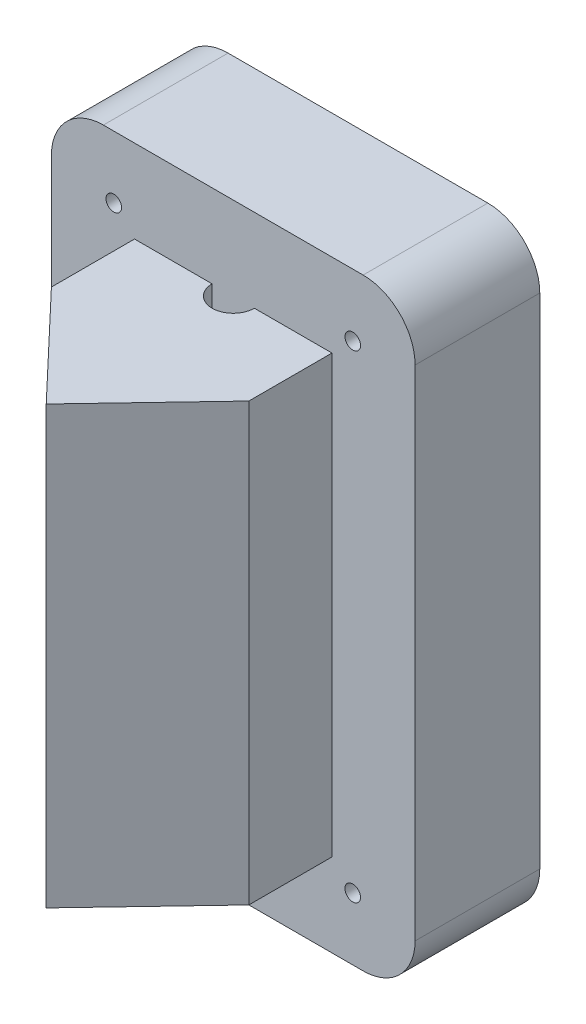
ISO-10303-21;
HEADER;
FILE_DESCRIPTION(('STEP AP214'),'2;1');
FILE_NAME('part.step','',(''),(''),'','','');
FILE_SCHEMA(('AUTOMOTIVE_DESIGN { 1 0 10303 214 1 1 1 1 }'));
ENDSEC;
DATA;
#1=APPLICATION_CONTEXT('core data for automotive mechanical design processes');
#2=APPLICATION_PROTOCOL_DEFINITION('international standard','automotive_design',2000,#1);
#3=PRODUCT_CONTEXT('',#1,'mechanical');
#4=PRODUCT('Part','Part','',(#3));
#5=PRODUCT_RELATED_PRODUCT_CATEGORY('part','',(#4));
#6=PRODUCT_DEFINITION_FORMATION('','',#4);
#7=PRODUCT_DEFINITION_CONTEXT('part definition',#1,'design');
#8=PRODUCT_DEFINITION('design','',#6,#7);
#9=PRODUCT_DEFINITION_SHAPE('','',#8);
#10=(LENGTH_UNIT() NAMED_UNIT(*) SI_UNIT(.MILLI.,.METRE.));
#11=(NAMED_UNIT(*) PLANE_ANGLE_UNIT() SI_UNIT($,.RADIAN.));
#12=(NAMED_UNIT(*) SI_UNIT($,.STERADIAN.) SOLID_ANGLE_UNIT());
#13=UNCERTAINTY_MEASURE_WITH_UNIT(LENGTH_MEASURE(1.E-05),#10,'distance_accuracy_value','');
#14=(GEOMETRIC_REPRESENTATION_CONTEXT(3) GLOBAL_UNCERTAINTY_ASSIGNED_CONTEXT((#13)) GLOBAL_UNIT_ASSIGNED_CONTEXT((#10,
#11,#12)) REPRESENTATION_CONTEXT('',''));
#15=CARTESIAN_POINT('',(0.,0.,0.));
#16=DIRECTION('',(0.,0.,1.));
#17=DIRECTION('',(1.,0.,0.));
#18=AXIS2_PLACEMENT_3D('',#15,#16,#17);
#19=CARTESIAN_POINT('',(-135.,250.,150.));
#20=DIRECTION('',(0.,-1.,0.));
#21=DIRECTION('',(0.,0.,-1.));
#22=AXIS2_PLACEMENT_3D('',#19,#20,#21);
#23=PLANE('',#22);
#24=DIRECTION('',(-1.,0.,0.));
#25=VECTOR('',#24,1.);
#26=CARTESIAN_POINT('',(-135.,250.,60.));
#27=LINE('',#26,#25);
#28=CARTESIAN_POINT('',(-40.,250.,60.));
#29=VERTEX_POINT('',#28);
#30=CARTESIAN_POINT('',(-77.3296602932821,250.,60.));
#31=VERTEX_POINT('',#30);
#32=EDGE_CURVE('E173',#29,#31,#27,.T.);
#33=ORIENTED_EDGE('',*,*,#32,.T.);
#34=CARTESIAN_POINT('',(-87.5,250.,60.));
#35=DIRECTION('',(0.,1.,0.));
#36=DIRECTION('',(0.,0.,1.));
#37=AXIS2_PLACEMENT_3D('',#34,#35,#36);
#38=CIRCLE('',#37,10.1703397067178);
#39=CARTESIAN_POINT('',(-97.6703397067178,250.,60.));
#40=VERTEX_POINT('',#39);
#41=EDGE_CURVE('E79',#40,#31,#38,.T.);
#42=ORIENTED_EDGE('',*,*,#41,.F.);
#43=CARTESIAN_POINT('',(-135.,250.,60.));
#44=VERTEX_POINT('',#43);
#45=EDGE_CURVE('E170',#40,#44,#27,.T.);
#46=ORIENTED_EDGE('',*,*,#45,.T.);
#47=DIRECTION('',(0.,0.,-1.));
#48=VECTOR('',#47,1.);
#49=CARTESIAN_POINT('',(-135.,250.,150.));
#50=LINE('',#49,#48);
#51=CARTESIAN_POINT('',(-135.,250.,100.));
#52=VERTEX_POINT('',#51);
#53=EDGE_CURVE('E196',#52,#44,#50,.T.);
#54=ORIENTED_EDGE('',*,*,#53,.F.);
#55=DIRECTION('',(0.688749461914693,0.,0.724999433594414));
#56=VECTOR('',#55,1.);
#57=CARTESIAN_POINT('',(-120.893561103811,250.,114.84888304862));
#58=LINE('',#57,#56);
#59=CARTESIAN_POINT('',(-87.5,250.,150.));
#60=VERTEX_POINT('',#59);
#61=EDGE_CURVE('E525',#52,#60,#58,.T.);
#62=ORIENTED_EDGE('',*,*,#61,.T.);
#63=DIRECTION('',(0.688749461914693,0.,-0.724999433594414));
#64=VECTOR('',#63,1.);
#65=CARTESIAN_POINT('',(28.9093298291721,250.,27.4638633377135));
#66=LINE('',#65,#64);
#67=CARTESIAN_POINT('',(-40.,250.,100.));
#68=VERTEX_POINT('',#67);
#69=EDGE_CURVE('E514',#60,#68,#66,.T.);
#70=ORIENTED_EDGE('',*,*,#69,.T.);
#71=DIRECTION('',(0.,0.,-1.));
#72=VECTOR('',#71,1.);
#73=CARTESIAN_POINT('',(-40.,250.,150.));
#74=LINE('',#73,#72);
#75=EDGE_CURVE('E198',#68,#29,#74,.T.);
#76=ORIENTED_EDGE('',*,*,#75,.T.);
#77=EDGE_LOOP('',(#33,#42,#46,#54,#62,#70,#76));
#78=FACE_BOUND('',#77,.T.);
#79=ADVANCED_FACE('F57',(#78),#23,.F.);
#80=CARTESIAN_POINT('',(-135.,40.,150.));
#81=DIRECTION('',(0.,1.,0.));
#82=DIRECTION('',(0.,0.,1.));
#83=AXIS2_PLACEMENT_3D('',#80,#81,#82);
#84=PLANE('',#83);
#85=DIRECTION('',(1.,0.,0.));
#86=VECTOR('',#85,1.);
#87=CARTESIAN_POINT('',(-135.,40.,60.));
#88=LINE('',#87,#86);
#89=CARTESIAN_POINT('',(-135.,40.,60.));
#90=VERTEX_POINT('',#89);
#91=CARTESIAN_POINT('',(-97.6703397067178,40.,60.));
#92=VERTEX_POINT('',#91);
#93=EDGE_CURVE('E189',#90,#92,#88,.T.);
#94=ORIENTED_EDGE('',*,*,#93,.T.);
#95=CARTESIAN_POINT('',(-87.5,40.,60.));
#96=DIRECTION('',(0.,1.,0.));
#97=DIRECTION('',(0.,0.,1.));
#98=AXIS2_PLACEMENT_3D('',#95,#96,#97);
#99=CIRCLE('',#98,10.1703397067178);
#100=CARTESIAN_POINT('',(-77.3296602932821,40.,60.));
#101=VERTEX_POINT('',#100);
#102=EDGE_CURVE('E163',#92,#101,#99,.T.);
#103=ORIENTED_EDGE('',*,*,#102,.T.);
#104=CARTESIAN_POINT('',(-40.,40.,60.));
#105=VERTEX_POINT('',#104);
#106=EDGE_CURVE('E188',#101,#105,#88,.T.);
#107=ORIENTED_EDGE('',*,*,#106,.T.);
#108=DIRECTION('',(0.,0.,-1.));
#109=VECTOR('',#108,1.);
#110=CARTESIAN_POINT('',(-40.,40.,150.));
#111=LINE('',#110,#109);
#112=CARTESIAN_POINT('',(-40.,40.,100.));
#113=VERTEX_POINT('',#112);
#114=EDGE_CURVE('E191',#113,#105,#111,.T.);
#115=ORIENTED_EDGE('',*,*,#114,.F.);
#116=DIRECTION('',(0.688749461914693,0.,-0.724999433594414));
#117=VECTOR('',#116,1.);
#118=CARTESIAN_POINT('',(-110.032851511169,40.,173.718791064389));
#119=LINE('',#118,#117);
#120=CARTESIAN_POINT('',(-87.5,40.,150.));
#121=VERTEX_POINT('',#120);
#122=EDGE_CURVE('E183',#121,#113,#119,.T.);
#123=ORIENTED_EDGE('',*,*,#122,.F.);
#124=DIRECTION('',(0.688749461914693,0.,0.724999433594414));
#125=VECTOR('',#124,1.);
#126=CARTESIAN_POINT('',(-110.032851511169,40.,126.281208935611));
#127=LINE('',#126,#125);
#128=CARTESIAN_POINT('',(-135.,40.,100.));
#129=VERTEX_POINT('',#128);
#130=EDGE_CURVE('E507',#129,#121,#127,.T.);
#131=ORIENTED_EDGE('',*,*,#130,.F.);
#132=DIRECTION('',(0.,0.,-1.));
#133=VECTOR('',#132,1.);
#134=CARTESIAN_POINT('',(-135.,40.,150.));
#135=LINE('',#134,#133);
#136=EDGE_CURVE('E194',#129,#90,#135,.T.);
#137=ORIENTED_EDGE('',*,*,#136,.T.);
#138=EDGE_LOOP('',(#94,#103,#107,#115,#123,#131,#137));
#139=FACE_BOUND('',#138,.T.);
#140=ADVANCED_FACE('F328',(#139),#84,.F.);
#141=CARTESIAN_POINT('',(-135.,40.,150.));
#142=DIRECTION('',(1.,0.,0.));
#143=DIRECTION('',(0.,0.,-1.));
#144=AXIS2_PLACEMENT_3D('',#141,#142,#143);
#145=PLANE('',#144);
#146=DIRECTION('',(0.,1.,0.));
#147=VECTOR('',#146,1.);
#148=CARTESIAN_POINT('',(-135.,0.,100.));
#149=LINE('',#148,#147);
#150=EDGE_CURVE('E511',#129,#52,#149,.T.);
#151=ORIENTED_EDGE('',*,*,#150,.T.);
#152=ORIENTED_EDGE('',*,*,#53,.T.);
#153=DIRECTION('',(0.,-1.,0.));
#154=VECTOR('',#153,1.);
#155=CARTESIAN_POINT('',(-135.,40.,60.));
#156=LINE('',#155,#154);
#157=EDGE_CURVE('E179',#44,#90,#156,.T.);
#158=ORIENTED_EDGE('',*,*,#157,.T.);
#159=ORIENTED_EDGE('',*,*,#136,.F.);
#160=EDGE_LOOP('',(#151,#152,#158,#159));
#161=FACE_BOUND('',#160,.T.);
#162=ADVANCED_FACE('F334',(#161),#145,.F.);
#163=CARTESIAN_POINT('',(-40.,250.,150.));
#164=DIRECTION('',(-1.,0.,0.));
#165=DIRECTION('',(0.,-1.,0.));
#166=AXIS2_PLACEMENT_3D('',#163,#164,#165);
#167=PLANE('',#166);
#168=DIRECTION('',(0.,1.,0.));
#169=VECTOR('',#168,1.);
#170=CARTESIAN_POINT('',(-40.,0.,100.));
#171=LINE('',#170,#169);
#172=EDGE_CURVE('E520',#113,#68,#171,.T.);
#173=ORIENTED_EDGE('',*,*,#172,.F.);
#174=ORIENTED_EDGE('',*,*,#114,.T.);
#175=DIRECTION('',(0.,1.,0.));
#176=VECTOR('',#175,1.);
#177=CARTESIAN_POINT('',(-40.,250.,60.));
#178=LINE('',#177,#176);
#179=EDGE_CURVE('E180',#105,#29,#178,.T.);
#180=ORIENTED_EDGE('',*,*,#179,.T.);
#181=ORIENTED_EDGE('',*,*,#75,.F.);
#182=EDGE_LOOP('',(#173,#174,#180,#181));
#183=FACE_BOUND('',#182,.T.);
#184=ADVANCED_FACE('F339',(#183),#167,.F.);
#185=CARTESIAN_POINT('',(0.,0.,60.));
#186=DIRECTION('',(0.,0.,1.));
#187=DIRECTION('',(1.,0.,0.));
#188=AXIS2_PLACEMENT_3D('',#185,#186,#187);
#189=PLANE('',#188);
#190=DIRECTION('',(0.,1.,0.));
#191=VECTOR('',#190,1.);
#192=CARTESIAN_POINT('',(-97.6703397067178,0.,60.));
#193=LINE('',#192,#191);
#194=EDGE_CURVE('E72',#92,#40,#193,.T.);
#195=ORIENTED_EDGE('',*,*,#194,.F.);
#196=ORIENTED_EDGE('',*,*,#93,.F.);
#197=ORIENTED_EDGE('',*,*,#157,.F.);
#198=ORIENTED_EDGE('',*,*,#45,.F.);
#199=EDGE_LOOP('',(#195,#196,#197,#198));
#200=FACE_BOUND('',#199,.T.);
#201=ORIENTED_EDGE('',*,*,#106,.F.);
#202=DIRECTION('',(0.,1.,0.));
#203=VECTOR('',#202,1.);
#204=CARTESIAN_POINT('',(-77.3296602932821,0.,60.));
#205=LINE('',#204,#203);
#206=EDGE_CURVE('E165',#101,#31,#205,.T.);
#207=ORIENTED_EDGE('',*,*,#206,.T.);
#208=ORIENTED_EDGE('',*,*,#32,.F.);
#209=ORIENTED_EDGE('',*,*,#179,.F.);
#210=EDGE_LOOP('',(#201,#207,#208,#209));
#211=FACE_BOUND('',#210,.T.);
#212=DIRECTION('',(1.,0.,0.));
#213=VECTOR('',#212,1.);
#214=CARTESIAN_POINT('',(0.,0.,60.));
#215=LINE('',#214,#213);
#216=CARTESIAN_POINT('',(-150.,0.,60.));
#217=VERTEX_POINT('',#216);
#218=CARTESIAN_POINT('',(-25.,0.,60.));
#219=VERTEX_POINT('',#218);
#220=EDGE_CURVE('E235',#217,#219,#215,.T.);
#221=ORIENTED_EDGE('',*,*,#220,.T.);
#222=CARTESIAN_POINT('',(-25.,25.,60.));
#223=DIRECTION('',(0.,0.,1.));
#224=DIRECTION('',(1.,0.,0.));
#225=AXIS2_PLACEMENT_3D('',#222,#223,#224);
#226=CIRCLE('',#225,25.);
#227=CARTESIAN_POINT('',(0.,25.,60.));
#228=VERTEX_POINT('',#227);
#229=EDGE_CURVE('E270',#219,#228,#226,.T.);
#230=ORIENTED_EDGE('',*,*,#229,.T.);
#231=DIRECTION('',(0.,1.,0.));
#232=VECTOR('',#231,1.);
#233=CARTESIAN_POINT('',(0.,0.,60.));
#234=LINE('',#233,#232);
#235=CARTESIAN_POINT('',(0.,265.,60.));
#236=VERTEX_POINT('',#235);
#237=EDGE_CURVE('E225',#228,#236,#234,.T.);
#238=ORIENTED_EDGE('',*,*,#237,.T.);
#239=CARTESIAN_POINT('',(-25.,265.,60.));
#240=DIRECTION('',(0.,0.,1.));
#241=DIRECTION('',(1.,0.,0.));
#242=AXIS2_PLACEMENT_3D('',#239,#240,#241);
#243=CIRCLE('',#242,25.);
#244=CARTESIAN_POINT('',(-25.,290.,60.));
#245=VERTEX_POINT('',#244);
#246=EDGE_CURVE('E268',#236,#245,#243,.T.);
#247=ORIENTED_EDGE('',*,*,#246,.T.);
#248=DIRECTION('',(-1.,0.,0.));
#249=VECTOR('',#248,1.);
#250=CARTESIAN_POINT('',(0.,290.,60.));
#251=LINE('',#250,#249);
#252=CARTESIAN_POINT('',(-150.,290.,60.));
#253=VERTEX_POINT('',#252);
#254=EDGE_CURVE('E228',#245,#253,#251,.T.);
#255=ORIENTED_EDGE('',*,*,#254,.T.);
#256=CARTESIAN_POINT('',(-150.,265.,60.));
#257=DIRECTION('',(0.,0.,1.));
#258=DIRECTION('',(1.,0.,0.));
#259=AXIS2_PLACEMENT_3D('',#256,#257,#258);
#260=CIRCLE('',#259,25.);
#261=CARTESIAN_POINT('',(-175.,265.,60.));
#262=VERTEX_POINT('',#261);
#263=EDGE_CURVE('E266',#253,#262,#260,.T.);
#264=ORIENTED_EDGE('',*,*,#263,.T.);
#265=DIRECTION('',(0.,-1.,0.));
#266=VECTOR('',#265,1.);
#267=CARTESIAN_POINT('',(-175.,0.,60.));
#268=LINE('',#267,#266);
#269=CARTESIAN_POINT('',(-175.,25.,60.));
#270=VERTEX_POINT('',#269);
#271=EDGE_CURVE('E232',#262,#270,#268,.T.);
#272=ORIENTED_EDGE('',*,*,#271,.T.);
#273=CARTESIAN_POINT('',(-150.,25.,60.));
#274=DIRECTION('',(0.,0.,1.));
#275=DIRECTION('',(1.,0.,0.));
#276=AXIS2_PLACEMENT_3D('',#273,#274,#275);
#277=CIRCLE('',#276,25.);
#278=EDGE_CURVE('E272',#270,#217,#277,.T.);
#279=ORIENTED_EDGE('',*,*,#278,.T.);
#280=EDGE_LOOP('',(#221,#230,#238,#247,#255,#264,#272,#279));
#281=FACE_BOUND('',#280,.T.);
#282=CARTESIAN_POINT('',(-30.,30.,60.));
#283=DIRECTION('',(0.,0.,1.));
#284=DIRECTION('',(1.,0.,0.));
#285=AXIS2_PLACEMENT_3D('',#282,#283,#284);
#286=CIRCLE('',#285,3.75);
#287=CARTESIAN_POINT('',(-26.25,30.,60.));
#288=VERTEX_POINT('',#287);
#289=EDGE_CURVE('E221',#288,#288,#286,.T.);
#290=ORIENTED_EDGE('',*,*,#289,.F.);
#291=EDGE_LOOP('',(#290));
#292=FACE_BOUND('',#291,.T.);
#293=CARTESIAN_POINT('',(-145.,260.,60.));
#294=DIRECTION('',(0.,0.,1.));
#295=DIRECTION('',(1.,0.,0.));
#296=AXIS2_PLACEMENT_3D('',#293,#294,#295);
#297=CIRCLE('',#296,3.75000000000001);
#298=CARTESIAN_POINT('',(-141.25,260.,60.));
#299=VERTEX_POINT('',#298);
#300=EDGE_CURVE('E218',#299,#299,#297,.T.);
#301=ORIENTED_EDGE('',*,*,#300,.F.);
#302=EDGE_LOOP('',(#301));
#303=FACE_BOUND('',#302,.T.);
#304=CARTESIAN_POINT('',(-30.,260.,60.));
#305=DIRECTION('',(0.,0.,1.));
#306=DIRECTION('',(1.,0.,0.));
#307=AXIS2_PLACEMENT_3D('',#304,#305,#306);
#308=CIRCLE('',#307,3.75);
#309=CARTESIAN_POINT('',(-26.25,260.,60.));
#310=VERTEX_POINT('',#309);
#311=EDGE_CURVE('E215',#310,#310,#308,.T.);
#312=ORIENTED_EDGE('',*,*,#311,.F.);
#313=EDGE_LOOP('',(#312));
#314=FACE_BOUND('',#313,.T.);
#315=CARTESIAN_POINT('',(-145.,30.,60.));
#316=DIRECTION('',(0.,0.,1.));
#317=DIRECTION('',(1.,0.,0.));
#318=AXIS2_PLACEMENT_3D('',#315,#316,#317);
#319=CIRCLE('',#318,3.75000000000001);
#320=CARTESIAN_POINT('',(-141.25,30.,60.));
#321=VERTEX_POINT('',#320);
#322=EDGE_CURVE('E212',#321,#321,#319,.T.);
#323=ORIENTED_EDGE('',*,*,#322,.F.);
#324=EDGE_LOOP('',(#323));
#325=FACE_BOUND('',#324,.T.);
#326=ADVANCED_FACE('F176',(#200,#211,#281,#292,#303,#314,#325),#189,.T.);
#327=CARTESIAN_POINT('',(0.,0.,60.));
#328=DIRECTION('',(-1.,0.,0.));
#329=DIRECTION('',(0.,0.,1.));
#330=AXIS2_PLACEMENT_3D('',#327,#328,#329);
#331=PLANE('',#330);
#332=ORIENTED_EDGE('',*,*,#237,.F.);
#333=DIRECTION('',(0.,0.,-1.));
#334=VECTOR('',#333,1.);
#335=CARTESIAN_POINT('',(0.,25.,60.));
#336=LINE('',#335,#334);
#337=CARTESIAN_POINT('',(0.,25.,0.));
#338=VERTEX_POINT('',#337);
#339=EDGE_CURVE('E276',#228,#338,#336,.T.);
#340=ORIENTED_EDGE('',*,*,#339,.T.);
#341=DIRECTION('',(0.,1.,0.));
#342=VECTOR('',#341,1.);
#343=CARTESIAN_POINT('',(0.,0.,0.));
#344=LINE('',#343,#342);
#345=CARTESIAN_POINT('',(0.,265.,0.));
#346=VERTEX_POINT('',#345);
#347=EDGE_CURVE('E224',#338,#346,#344,.T.);
#348=ORIENTED_EDGE('',*,*,#347,.T.);
#349=DIRECTION('',(0.,0.,-1.));
#350=VECTOR('',#349,1.);
#351=CARTESIAN_POINT('',(0.,265.,60.));
#352=LINE('',#351,#350);
#353=EDGE_CURVE('E274',#346,#236,#352,.F.);
#354=ORIENTED_EDGE('',*,*,#353,.T.);
#355=EDGE_LOOP('',(#332,#340,#348,#354));
#356=FACE_BOUND('',#355,.T.);
#357=ADVANCED_FACE('F317',(#356),#331,.F.);
#358=CARTESIAN_POINT('',(0.,290.,60.));
#359=DIRECTION('',(0.,-1.,0.));
#360=DIRECTION('',(0.,0.,-1.));
#361=AXIS2_PLACEMENT_3D('',#358,#359,#360);
#362=PLANE('',#361);
#363=ORIENTED_EDGE('',*,*,#254,.F.);
#364=DIRECTION('',(0.,0.,-1.));
#365=VECTOR('',#364,1.);
#366=CARTESIAN_POINT('',(-25.,290.,60.));
#367=LINE('',#366,#365);
#368=CARTESIAN_POINT('',(-25.,290.,0.));
#369=VERTEX_POINT('',#368);
#370=EDGE_CURVE('E65',#245,#369,#367,.T.);
#371=ORIENTED_EDGE('',*,*,#370,.T.);
#372=DIRECTION('',(-1.,0.,0.));
#373=VECTOR('',#372,1.);
#374=CARTESIAN_POINT('',(0.,290.,0.));
#375=LINE('',#374,#373);
#376=CARTESIAN_POINT('',(-150.,290.,0.));
#377=VERTEX_POINT('',#376);
#378=EDGE_CURVE('E240',#369,#377,#375,.T.);
#379=ORIENTED_EDGE('',*,*,#378,.T.);
#380=DIRECTION('',(0.,0.,-1.));
#381=VECTOR('',#380,1.);
#382=CARTESIAN_POINT('',(-150.,290.,60.));
#383=LINE('',#382,#381);
#384=EDGE_CURVE('E279',#377,#253,#383,.F.);
#385=ORIENTED_EDGE('',*,*,#384,.T.);
#386=EDGE_LOOP('',(#363,#371,#379,#385));
#387=FACE_BOUND('',#386,.T.);
#388=ADVANCED_FACE('F285',(#387),#362,.F.);
#389=CARTESIAN_POINT('',(-175.,0.,60.));
#390=DIRECTION('',(1.,0.,0.));
#391=DIRECTION('',(0.,0.,-1.));
#392=AXIS2_PLACEMENT_3D('',#389,#390,#391);
#393=PLANE('',#392);
#394=DIRECTION('',(0.,-1.,0.));
#395=VECTOR('',#394,1.);
#396=CARTESIAN_POINT('',(-175.,0.,0.));
#397=LINE('',#396,#395);
#398=CARTESIAN_POINT('',(-175.,265.,0.));
#399=VERTEX_POINT('',#398);
#400=CARTESIAN_POINT('',(-175.,25.,0.));
#401=VERTEX_POINT('',#400);
#402=EDGE_CURVE('E243',#399,#401,#397,.T.);
#403=ORIENTED_EDGE('',*,*,#402,.T.);
#404=DIRECTION('',(0.,0.,-1.));
#405=VECTOR('',#404,1.);
#406=CARTESIAN_POINT('',(-175.,25.,60.));
#407=LINE('',#406,#405);
#408=EDGE_CURVE('E264',#401,#270,#407,.F.);
#409=ORIENTED_EDGE('',*,*,#408,.T.);
#410=ORIENTED_EDGE('',*,*,#271,.F.);
#411=DIRECTION('',(0.,0.,-1.));
#412=VECTOR('',#411,1.);
#413=CARTESIAN_POINT('',(-175.,265.,60.));
#414=LINE('',#413,#412);
#415=EDGE_CURVE('E261',#262,#399,#414,.T.);
#416=ORIENTED_EDGE('',*,*,#415,.T.);
#417=EDGE_LOOP('',(#403,#409,#410,#416));
#418=FACE_BOUND('',#417,.T.);
#419=ADVANCED_FACE('F299',(#418),#393,.F.);
#420=CARTESIAN_POINT('',(0.,0.,60.));
#421=DIRECTION('',(0.,1.,0.));
#422=DIRECTION('',(-1.,0.,0.));
#423=AXIS2_PLACEMENT_3D('',#420,#421,#422);
#424=PLANE('',#423);
#425=ORIENTED_EDGE('',*,*,#220,.F.);
#426=DIRECTION('',(0.,0.,-1.));
#427=VECTOR('',#426,1.);
#428=CARTESIAN_POINT('',(-150.,0.,60.));
#429=LINE('',#428,#427);
#430=CARTESIAN_POINT('',(-150.,0.,0.));
#431=VERTEX_POINT('',#430);
#432=EDGE_CURVE('E250',#217,#431,#429,.T.);
#433=ORIENTED_EDGE('',*,*,#432,.T.);
#434=DIRECTION('',(1.,0.,0.));
#435=VECTOR('',#434,1.);
#436=CARTESIAN_POINT('',(0.,0.,0.));
#437=LINE('',#436,#435);
#438=CARTESIAN_POINT('',(-25.,0.,0.));
#439=VERTEX_POINT('',#438);
#440=EDGE_CURVE('E229',#431,#439,#437,.T.);
#441=ORIENTED_EDGE('',*,*,#440,.T.);
#442=DIRECTION('',(0.,0.,-1.));
#443=VECTOR('',#442,1.);
#444=CARTESIAN_POINT('',(-25.,0.,60.));
#445=LINE('',#444,#443);
#446=EDGE_CURVE('E237',#439,#219,#445,.F.);
#447=ORIENTED_EDGE('',*,*,#446,.T.);
#448=EDGE_LOOP('',(#425,#433,#441,#447));
#449=FACE_BOUND('',#448,.T.);
#450=ADVANCED_FACE('F309',(#449),#424,.F.);
#451=CARTESIAN_POINT('',(0.,0.,0.));
#452=DIRECTION('',(0.,0.,1.));
#453=DIRECTION('',(1.,0.,0.));
#454=AXIS2_PLACEMENT_3D('',#451,#452,#453);
#455=PLANE('',#454);
#456=CARTESIAN_POINT('',(-30.,30.,0.));
#457=DIRECTION('',(0.,0.,1.));
#458=DIRECTION('',(1.,0.,0.));
#459=AXIS2_PLACEMENT_3D('',#456,#457,#458);
#460=CIRCLE('',#459,3.75);
#461=CARTESIAN_POINT('',(-26.25,30.,0.));
#462=VERTEX_POINT('',#461);
#463=EDGE_CURVE('E204',#462,#462,#460,.T.);
#464=ORIENTED_EDGE('',*,*,#463,.T.);
#465=EDGE_LOOP('',(#464));
#466=FACE_BOUND('',#465,.T.);
#467=CARTESIAN_POINT('',(-145.,260.,0.));
#468=DIRECTION('',(0.,0.,1.));
#469=DIRECTION('',(1.,0.,0.));
#470=AXIS2_PLACEMENT_3D('',#467,#468,#469);
#471=CIRCLE('',#470,3.75000000000001);
#472=CARTESIAN_POINT('',(-141.25,260.,0.));
#473=VERTEX_POINT('',#472);
#474=EDGE_CURVE('E203',#473,#473,#471,.T.);
#475=ORIENTED_EDGE('',*,*,#474,.T.);
#476=EDGE_LOOP('',(#475));
#477=FACE_BOUND('',#476,.T.);
#478=CARTESIAN_POINT('',(-30.,260.,0.));
#479=DIRECTION('',(0.,0.,1.));
#480=DIRECTION('',(1.,0.,0.));
#481=AXIS2_PLACEMENT_3D('',#478,#479,#480);
#482=CIRCLE('',#481,3.75);
#483=CARTESIAN_POINT('',(-26.25,260.,0.));
#484=VERTEX_POINT('',#483);
#485=EDGE_CURVE('E200',#484,#484,#482,.T.);
#486=ORIENTED_EDGE('',*,*,#485,.T.);
#487=EDGE_LOOP('',(#486));
#488=FACE_BOUND('',#487,.T.);
#489=CARTESIAN_POINT('',(-145.,30.,0.));
#490=DIRECTION('',(0.,0.,1.));
#491=DIRECTION('',(1.,0.,0.));
#492=AXIS2_PLACEMENT_3D('',#489,#490,#491);
#493=CIRCLE('',#492,3.75000000000001);
#494=CARTESIAN_POINT('',(-141.25,30.,0.));
#495=VERTEX_POINT('',#494);
#496=EDGE_CURVE('E207',#495,#495,#493,.T.);
#497=ORIENTED_EDGE('',*,*,#496,.T.);
#498=EDGE_LOOP('',(#497));
#499=FACE_BOUND('',#498,.T.);
#500=ORIENTED_EDGE('',*,*,#440,.F.);
#501=CARTESIAN_POINT('',(-150.,25.,0.));
#502=DIRECTION('',(0.,0.,1.));
#503=DIRECTION('',(1.,0.,0.));
#504=AXIS2_PLACEMENT_3D('',#501,#502,#503);
#505=CIRCLE('',#504,25.);
#506=EDGE_CURVE('E259',#431,#401,#505,.F.);
#507=ORIENTED_EDGE('',*,*,#506,.T.);
#508=ORIENTED_EDGE('',*,*,#402,.F.);
#509=CARTESIAN_POINT('',(-150.,265.,0.));
#510=DIRECTION('',(0.,0.,1.));
#511=DIRECTION('',(1.,0.,0.));
#512=AXIS2_PLACEMENT_3D('',#509,#510,#511);
#513=CIRCLE('',#512,25.);
#514=EDGE_CURVE('E253',#399,#377,#513,.F.);
#515=ORIENTED_EDGE('',*,*,#514,.T.);
#516=ORIENTED_EDGE('',*,*,#378,.F.);
#517=CARTESIAN_POINT('',(-25.,265.,0.));
#518=DIRECTION('',(0.,0.,1.));
#519=DIRECTION('',(1.,0.,0.));
#520=AXIS2_PLACEMENT_3D('',#517,#518,#519);
#521=CIRCLE('',#520,25.);
#522=EDGE_CURVE('E255',#369,#346,#521,.F.);
#523=ORIENTED_EDGE('',*,*,#522,.T.);
#524=ORIENTED_EDGE('',*,*,#347,.F.);
#525=CARTESIAN_POINT('',(-25.,25.,0.));
#526=DIRECTION('',(0.,0.,1.));
#527=DIRECTION('',(1.,0.,0.));
#528=AXIS2_PLACEMENT_3D('',#525,#526,#527);
#529=CIRCLE('',#528,25.);
#530=EDGE_CURVE('E257',#338,#439,#529,.F.);
#531=ORIENTED_EDGE('',*,*,#530,.T.);
#532=EDGE_LOOP('',(#500,#507,#508,#515,#516,#523,#524,#531));
#533=FACE_BOUND('',#532,.T.);
#534=ADVANCED_FACE('F291',(#466,#477,#488,#499,#533),#455,.F.);
#535=CARTESIAN_POINT('',(-150.,25.,60.));
#536=DIRECTION('',(0.,0.,-1.));
#537=DIRECTION('',(-1.,0.,0.));
#538=AXIS2_PLACEMENT_3D('',#535,#536,#537);
#539=CYLINDRICAL_SURFACE('',#538,25.);
#540=ORIENTED_EDGE('',*,*,#278,.F.);
#541=ORIENTED_EDGE('',*,*,#408,.F.);
#542=ORIENTED_EDGE('',*,*,#506,.F.);
#543=ORIENTED_EDGE('',*,*,#432,.F.);
#544=EDGE_LOOP('',(#540,#541,#542,#543));
#545=FACE_BOUND('',#544,.T.);
#546=ADVANCED_FACE('F307',(#545),#539,.T.);
#547=CARTESIAN_POINT('',(-25.,25.,60.));
#548=DIRECTION('',(0.,0.,-1.));
#549=DIRECTION('',(-1.,0.,0.));
#550=AXIS2_PLACEMENT_3D('',#547,#548,#549);
#551=CYLINDRICAL_SURFACE('',#550,25.);
#552=ORIENTED_EDGE('',*,*,#229,.F.);
#553=ORIENTED_EDGE('',*,*,#446,.F.);
#554=ORIENTED_EDGE('',*,*,#530,.F.);
#555=ORIENTED_EDGE('',*,*,#339,.F.);
#556=EDGE_LOOP('',(#552,#553,#554,#555));
#557=FACE_BOUND('',#556,.T.);
#558=ADVANCED_FACE('F314',(#557),#551,.T.);
#559=CARTESIAN_POINT('',(-25.,265.,60.));
#560=DIRECTION('',(0.,0.,-1.));
#561=DIRECTION('',(-1.,0.,0.));
#562=AXIS2_PLACEMENT_3D('',#559,#560,#561);
#563=CYLINDRICAL_SURFACE('',#562,25.);
#564=ORIENTED_EDGE('',*,*,#246,.F.);
#565=ORIENTED_EDGE('',*,*,#353,.F.);
#566=ORIENTED_EDGE('',*,*,#522,.F.);
#567=ORIENTED_EDGE('',*,*,#370,.F.);
#568=EDGE_LOOP('',(#564,#565,#566,#567));
#569=FACE_BOUND('',#568,.T.);
#570=ADVANCED_FACE('F319',(#569),#563,.T.);
#571=CARTESIAN_POINT('',(-150.,265.,60.));
#572=DIRECTION('',(0.,0.,-1.));
#573=DIRECTION('',(-1.,0.,0.));
#574=AXIS2_PLACEMENT_3D('',#571,#572,#573);
#575=CYLINDRICAL_SURFACE('',#574,25.);
#576=ORIENTED_EDGE('',*,*,#263,.F.);
#577=ORIENTED_EDGE('',*,*,#384,.F.);
#578=ORIENTED_EDGE('',*,*,#514,.F.);
#579=ORIENTED_EDGE('',*,*,#415,.F.);
#580=EDGE_LOOP('',(#576,#577,#578,#579));
#581=FACE_BOUND('',#580,.T.);
#582=ADVANCED_FACE('F59',(#581),#575,.T.);
#583=CARTESIAN_POINT('',(-145.,30.,0.));
#584=DIRECTION('',(0.,0.,1.));
#585=DIRECTION('',(1.,0.,0.));
#586=AXIS2_PLACEMENT_3D('',#583,#584,#585);
#587=CYLINDRICAL_SURFACE('',#586,3.75000000000001);
#588=ORIENTED_EDGE('',*,*,#322,.T.);
#589=EDGE_LOOP('',(#588));
#590=FACE_BOUND('',#589,.T.);
#591=ORIENTED_EDGE('',*,*,#496,.F.);
#592=EDGE_LOOP('',(#591));
#593=FACE_BOUND('',#592,.T.);
#594=ADVANCED_FACE('F325',(#590,#593),#587,.F.);
#595=CARTESIAN_POINT('',(-30.,260.,0.));
#596=DIRECTION('',(0.,0.,1.));
#597=DIRECTION('',(1.,0.,0.));
#598=AXIS2_PLACEMENT_3D('',#595,#596,#597);
#599=CYLINDRICAL_SURFACE('',#598,3.75);
#600=ORIENTED_EDGE('',*,*,#311,.T.);
#601=EDGE_LOOP('',(#600));
#602=FACE_BOUND('',#601,.T.);
#603=ORIENTED_EDGE('',*,*,#485,.F.);
#604=EDGE_LOOP('',(#603));
#605=FACE_BOUND('',#604,.T.);
#606=ADVANCED_FACE('F343',(#602,#605),#599,.F.);
#607=CARTESIAN_POINT('',(-145.,260.,0.));
#608=DIRECTION('',(0.,0.,1.));
#609=DIRECTION('',(1.,0.,0.));
#610=AXIS2_PLACEMENT_3D('',#607,#608,#609);
#611=CYLINDRICAL_SURFACE('',#610,3.75000000000001);
#612=ORIENTED_EDGE('',*,*,#300,.T.);
#613=EDGE_LOOP('',(#612));
#614=FACE_BOUND('',#613,.T.);
#615=ORIENTED_EDGE('',*,*,#474,.F.);
#616=EDGE_LOOP('',(#615));
#617=FACE_BOUND('',#616,.T.);
#618=ADVANCED_FACE('F346',(#614,#617),#611,.F.);
#619=CARTESIAN_POINT('',(-30.,30.,0.));
#620=DIRECTION('',(0.,0.,1.));
#621=DIRECTION('',(1.,0.,0.));
#622=AXIS2_PLACEMENT_3D('',#619,#620,#621);
#623=CYLINDRICAL_SURFACE('',#622,3.75);
#624=ORIENTED_EDGE('',*,*,#289,.T.);
#625=EDGE_LOOP('',(#624));
#626=FACE_BOUND('',#625,.T.);
#627=ORIENTED_EDGE('',*,*,#463,.F.);
#628=EDGE_LOOP('',(#627));
#629=FACE_BOUND('',#628,.T.);
#630=ADVANCED_FACE('F348',(#626,#629),#623,.F.);
#631=CARTESIAN_POINT('',(28.9093298291721,0.,27.4638633377135));
#632=DIRECTION('',(0.724999433594414,0.,0.688749461914693));
#633=DIRECTION('',(0.688749461914693,0.,-0.724999433594414));
#634=AXIS2_PLACEMENT_3D('',#631,#632,#633);
#635=PLANE('',#634);
#636=ORIENTED_EDGE('',*,*,#122,.T.);
#637=ORIENTED_EDGE('',*,*,#172,.T.);
#638=ORIENTED_EDGE('',*,*,#69,.F.);
#639=DIRECTION('',(0.,1.,0.));
#640=VECTOR('',#639,1.);
#641=CARTESIAN_POINT('',(-87.4999999999999,0.,150.));
#642=LINE('',#641,#640);
#643=EDGE_CURVE('E12',#121,#60,#642,.T.);
#644=ORIENTED_EDGE('',*,*,#643,.F.);
#645=EDGE_LOOP('',(#636,#637,#638,#644));
#646=FACE_BOUND('',#645,.T.);
#647=ADVANCED_FACE('F351',(#646),#635,.T.);
#648=CARTESIAN_POINT('',(-120.893561103811,0.,114.84888304862));
#649=DIRECTION('',(-0.724999433594414,0.,0.688749461914693));
#650=DIRECTION('',(0.688749461914693,0.,0.724999433594414));
#651=AXIS2_PLACEMENT_3D('',#648,#649,#650);
#652=PLANE('',#651);
#653=ORIENTED_EDGE('',*,*,#130,.T.);
#654=ORIENTED_EDGE('',*,*,#643,.T.);
#655=ORIENTED_EDGE('',*,*,#61,.F.);
#656=ORIENTED_EDGE('',*,*,#150,.F.);
#657=EDGE_LOOP('',(#653,#654,#655,#656));
#658=FACE_BOUND('',#657,.T.);
#659=ADVANCED_FACE('F455',(#658),#652,.T.);
#660=CARTESIAN_POINT('',(-87.5,0.,60.));
#661=DIRECTION('',(0.,1.,0.));
#662=DIRECTION('',(0.,0.,1.));
#663=AXIS2_PLACEMENT_3D('',#660,#661,#662);
#664=CYLINDRICAL_SURFACE('',#663,10.1703397067178);
#665=ORIENTED_EDGE('',*,*,#194,.T.);
#666=ORIENTED_EDGE('',*,*,#41,.T.);
#667=ORIENTED_EDGE('',*,*,#206,.F.);
#668=ORIENTED_EDGE('',*,*,#102,.F.);
#669=EDGE_LOOP('',(#665,#666,#667,#668));
#670=FACE_BOUND('',#669,.T.);
#671=ADVANCED_FACE('F161',(#670),#664,.F.);
#672=CLOSED_SHELL('',(#79,#140,#162,#184,#326,#357,#388,#419,#450,#534,#546,#558,#570,#582,#594,
#606,#618,#630,#647,#659,#671));
#673=MANIFOLD_SOLID_BREP('B2',#672);
#674=ADVANCED_BREP_SHAPE_REPRESENTATION('',(#18,#673),#14);
#675=SHAPE_DEFINITION_REPRESENTATION(#9,#674);
ENDSEC;
END-ISO-10303-21;
